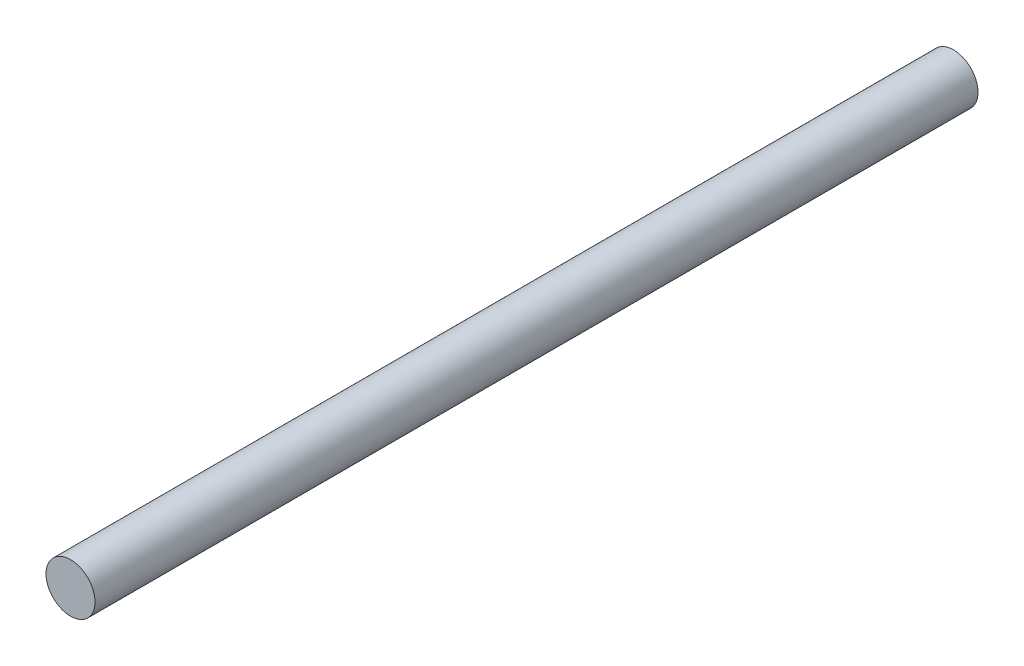
ISO-10303-21;
HEADER;
FILE_DESCRIPTION(('STEP AP214'),'2;1');
FILE_NAME('part.step','',(''),(''),'','','');
FILE_SCHEMA(('AUTOMOTIVE_DESIGN { 1 0 10303 214 1 1 1 1 }'));
ENDSEC;
DATA;
#1=APPLICATION_CONTEXT('core data for automotive mechanical design processes');
#2=APPLICATION_PROTOCOL_DEFINITION('international standard','automotive_design',2000,#1);
#3=PRODUCT_CONTEXT('',#1,'mechanical');
#4=PRODUCT('Part','Part','',(#3));
#5=PRODUCT_RELATED_PRODUCT_CATEGORY('part','',(#4));
#6=PRODUCT_DEFINITION_FORMATION('','',#4);
#7=PRODUCT_DEFINITION_CONTEXT('part definition',#1,'design');
#8=PRODUCT_DEFINITION('design','',#6,#7);
#9=PRODUCT_DEFINITION_SHAPE('','',#8);
#10=(LENGTH_UNIT() NAMED_UNIT(*) SI_UNIT(.MILLI.,.METRE.));
#11=(NAMED_UNIT(*) PLANE_ANGLE_UNIT() SI_UNIT($,.RADIAN.));
#12=(NAMED_UNIT(*) SI_UNIT($,.STERADIAN.) SOLID_ANGLE_UNIT());
#13=UNCERTAINTY_MEASURE_WITH_UNIT(LENGTH_MEASURE(1.E-05),#10,'distance_accuracy_value','');
#14=(GEOMETRIC_REPRESENTATION_CONTEXT(3) GLOBAL_UNCERTAINTY_ASSIGNED_CONTEXT((#13)) GLOBAL_UNIT_ASSIGNED_CONTEXT((#10,
#11,#12)) REPRESENTATION_CONTEXT('',''));
#15=CARTESIAN_POINT('',(0.,0.,0.));
#16=DIRECTION('',(0.,0.,1.));
#17=DIRECTION('',(1.,0.,0.));
#18=AXIS2_PLACEMENT_3D('',#15,#16,#17);
#19=CARTESIAN_POINT('',(0.,0.,457.2));
#20=DIRECTION('',(0.,0.,-1.));
#21=DIRECTION('',(-1.,0.,0.));
#22=AXIS2_PLACEMENT_3D('',#19,#20,#21);
#23=CYLINDRICAL_SURFACE('',#22,12.7);
#24=CARTESIAN_POINT('',(0.,0.,457.2));
#25=DIRECTION('',(0.,0.,1.));
#26=DIRECTION('',(1.,0.,0.));
#27=AXIS2_PLACEMENT_3D('',#24,#25,#26);
#28=CIRCLE('',#27,12.7);
#29=CARTESIAN_POINT('',(-12.7,0.,457.2));
#30=VERTEX_POINT('',#29);
#31=EDGE_CURVE('E10',#30,#30,#28,.T.);
#32=CARTESIAN_POINT('',(0.,0.,0.));
#33=DIRECTION('',(0.,0.,1.));
#34=DIRECTION('',(1.,0.,0.));
#35=AXIS2_PLACEMENT_3D('',#32,#33,#34);
#36=CIRCLE('',#35,12.7);
#37=CARTESIAN_POINT('',(-12.7,0.,0.));
#38=VERTEX_POINT('',#37);
#39=EDGE_CURVE('E40',#38,#38,#36,.T.);
#40=CARTESIAN_POINT('',(-12.7,0.,457.2));
#41=CARTESIAN_POINT('',(-12.7,0.,452.4375));
#42=CARTESIAN_POINT('',(-12.7,0.,447.675));
#43=CARTESIAN_POINT('',(-12.7,0.,438.15));
#44=CARTESIAN_POINT('',(-12.7,0.,433.3875));
#45=CARTESIAN_POINT('',(-12.7,0.,423.8625));
#46=CARTESIAN_POINT('',(-12.7,0.,419.1));
#47=CARTESIAN_POINT('',(-12.7,0.,409.575));
#48=CARTESIAN_POINT('',(-12.7,0.,404.8125));
#49=CARTESIAN_POINT('',(-12.7,0.,395.2875));
#50=CARTESIAN_POINT('',(-12.7,0.,390.525));
#51=CARTESIAN_POINT('',(-12.7,0.,381.));
#52=CARTESIAN_POINT('',(-12.7,0.,376.2375));
#53=CARTESIAN_POINT('',(-12.7,0.,366.7125));
#54=CARTESIAN_POINT('',(-12.7,0.,361.95));
#55=CARTESIAN_POINT('',(-12.7,0.,352.425));
#56=CARTESIAN_POINT('',(-12.7,0.,347.6625));
#57=CARTESIAN_POINT('',(-12.7,0.,338.1375));
#58=CARTESIAN_POINT('',(-12.7,0.,333.375));
#59=CARTESIAN_POINT('',(-12.7,0.,323.85));
#60=CARTESIAN_POINT('',(-12.7,0.,319.0875));
#61=CARTESIAN_POINT('',(-12.7,0.,309.5625));
#62=CARTESIAN_POINT('',(-12.7,0.,304.8));
#63=CARTESIAN_POINT('',(-12.7,0.,295.275));
#64=CARTESIAN_POINT('',(-12.7,0.,290.5125));
#65=CARTESIAN_POINT('',(-12.7,0.,280.9875));
#66=CARTESIAN_POINT('',(-12.7,0.,276.225));
#67=CARTESIAN_POINT('',(-12.7,0.,266.7));
#68=CARTESIAN_POINT('',(-12.7,0.,261.9375));
#69=CARTESIAN_POINT('',(-12.7,0.,252.4125));
#70=CARTESIAN_POINT('',(-12.7,0.,247.65));
#71=CARTESIAN_POINT('',(-12.7,0.,238.125));
#72=CARTESIAN_POINT('',(-12.7,0.,233.3625));
#73=CARTESIAN_POINT('',(-12.7,0.,223.8375));
#74=CARTESIAN_POINT('',(-12.7,0.,219.075));
#75=CARTESIAN_POINT('',(-12.7,0.,209.55));
#76=CARTESIAN_POINT('',(-12.7,0.,204.7875));
#77=CARTESIAN_POINT('',(-12.7,0.,195.2625));
#78=CARTESIAN_POINT('',(-12.7,0.,190.5));
#79=CARTESIAN_POINT('',(-12.7,0.,180.975));
#80=CARTESIAN_POINT('',(-12.7,0.,176.2125));
#81=CARTESIAN_POINT('',(-12.7,0.,166.6875));
#82=CARTESIAN_POINT('',(-12.7,0.,161.925));
#83=CARTESIAN_POINT('',(-12.7,0.,152.4));
#84=CARTESIAN_POINT('',(-12.7,0.,147.6375));
#85=CARTESIAN_POINT('',(-12.7,0.,138.1125));
#86=CARTESIAN_POINT('',(-12.7,0.,133.35));
#87=CARTESIAN_POINT('',(-12.7,0.,123.825));
#88=CARTESIAN_POINT('',(-12.7,0.,119.0625));
#89=CARTESIAN_POINT('',(-12.7,0.,109.5375));
#90=CARTESIAN_POINT('',(-12.7,0.,104.775));
#91=CARTESIAN_POINT('',(-12.7,0.,95.25));
#92=CARTESIAN_POINT('',(-12.7,0.,90.4875));
#93=CARTESIAN_POINT('',(-12.7,0.,80.9625));
#94=CARTESIAN_POINT('',(-12.7,0.,76.2));
#95=CARTESIAN_POINT('',(-12.7,0.,66.675));
#96=CARTESIAN_POINT('',(-12.7,0.,61.9125));
#97=CARTESIAN_POINT('',(-12.7,0.,52.3875));
#98=CARTESIAN_POINT('',(-12.7,0.,47.625));
#99=CARTESIAN_POINT('',(-12.7,0.,38.1));
#100=CARTESIAN_POINT('',(-12.7,0.,33.3375));
#101=CARTESIAN_POINT('',(-12.7,0.,23.8125));
#102=CARTESIAN_POINT('',(-12.7,0.,19.05));
#103=CARTESIAN_POINT('',(-12.7,0.,9.52499999999995));
#104=CARTESIAN_POINT('',(-12.7,0.,4.76249999999994));
#105=CARTESIAN_POINT('',(-12.7,0.,0.));
#106=B_SPLINE_CURVE_WITH_KNOTS('',3,(#40,#41,#42,#43,#44,#45,#46,#47,#48,#49,#50,#51,#52,#53,
#54,#55,#56,#57,#58,#59,#60,#61,#62,#63,#64,#65,#66,#67,#68,#69,#70,#71,#72,#73,#74,#75,#76,#77,
#78,#79,#80,#81,#82,#83,#84,#85,#86,#87,#88,#89,#90,#91,#92,#93,#94,#95,#96,#97,#98,#99,#100,
#101,#102,#103,#104,#105),.UNSPECIFIED.,.F.,.F.,(4,2,2,2,2,2,2,2,2,2,2,2,2,2,2,2,2,2,2,2,2,2,2,
2,2,2,2,2,2,2,2,2,4),(0.,14.2875,28.575,42.8625,57.15,71.4375,85.7250000000001,100.0125,114.3,
128.5875,142.875,157.1625,171.45,185.7375,200.025,214.3125,228.6,242.8875,257.175,271.4625,
285.75,300.0375,314.325,328.6125,342.9,357.1875,371.475,385.7625,400.05,414.3375,428.625,
442.9125,457.2),.UNSPECIFIED.);
#107=EDGE_CURVE('BSEAM37',#30,#38,#106,.T.);
#108=ORIENTED_EDGE('',*,*,#31,.F.);
#109=ORIENTED_EDGE('',*,*,#39,.T.);
#110=ORIENTED_EDGE('',*,*,#107,.T.);
#111=ORIENTED_EDGE('',*,*,#107,.F.);
#112=EDGE_LOOP('',(#108,#110,#109,#111));
#113=FACE_BOUND('',#112,.T.);
#114=ADVANCED_FACE('F37',(#113),#23,.T.);
#115=CARTESIAN_POINT('',(0.,0.,457.2));
#116=DIRECTION('',(0.,0.,1.));
#117=DIRECTION('',(1.,0.,0.));
#118=AXIS2_PLACEMENT_3D('',#115,#116,#117);
#119=PLANE('',#118);
#120=ORIENTED_EDGE('',*,*,#31,.T.);
#121=EDGE_LOOP('',(#120));
#122=FACE_BOUND('',#121,.T.);
#123=ADVANCED_FACE('F54',(#122),#119,.T.);
#124=CARTESIAN_POINT('',(0.,0.,0.));
#125=DIRECTION('',(0.,0.,1.));
#126=DIRECTION('',(1.,0.,0.));
#127=AXIS2_PLACEMENT_3D('',#124,#125,#126);
#128=PLANE('',#127);
#129=ORIENTED_EDGE('',*,*,#39,.F.);
#130=EDGE_LOOP('',(#129));
#131=FACE_BOUND('',#130,.T.);
#132=ADVANCED_FACE('F52',(#131),#128,.F.);
#133=CLOSED_SHELL('',(#114,#123,#132));
#134=MANIFOLD_SOLID_BREP('B2',#133);
#135=ADVANCED_BREP_SHAPE_REPRESENTATION('',(#18,#134),#14);
#136=SHAPE_DEFINITION_REPRESENTATION(#9,#135);
ENDSEC;
END-ISO-10303-21;
